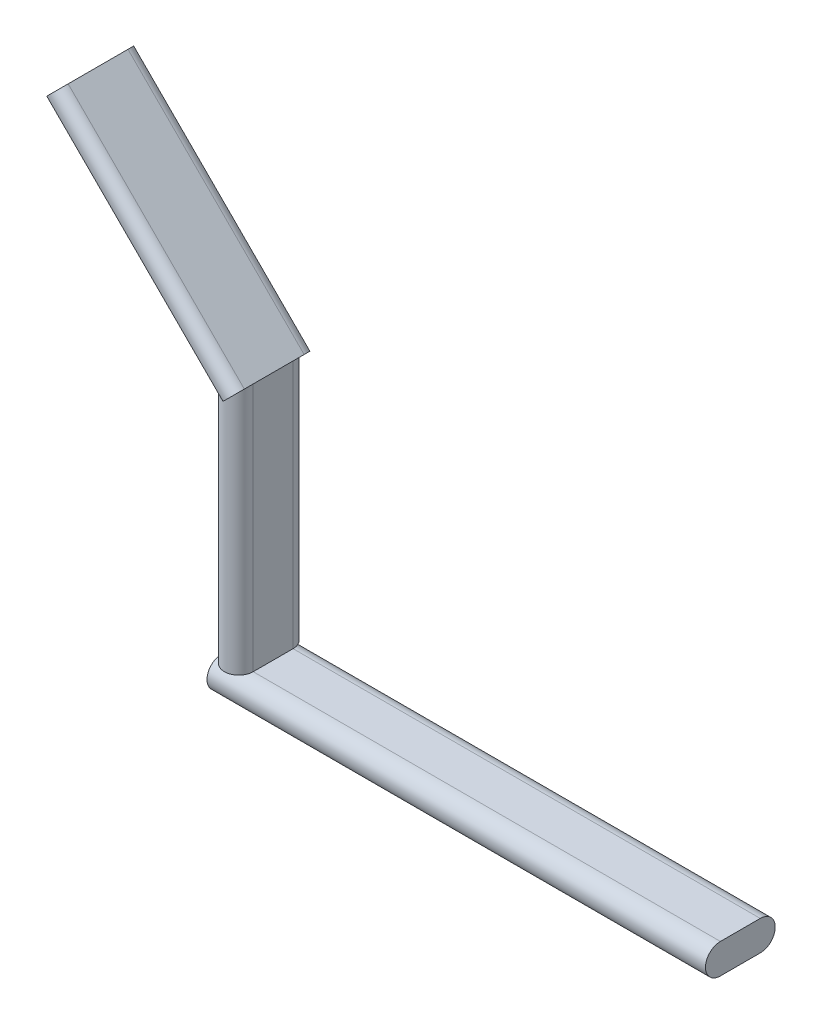
ISO-10303-21;
HEADER;
FILE_DESCRIPTION(('STEP AP214'),'2;1');
FILE_NAME('part.step','',(''),(''),'','','');
FILE_SCHEMA(('AUTOMOTIVE_DESIGN { 1 0 10303 214 1 1 1 1 }'));
ENDSEC;
DATA;
#1=APPLICATION_CONTEXT('core data for automotive mechanical design processes');
#2=APPLICATION_PROTOCOL_DEFINITION('international standard','automotive_design',2000,#1);
#3=PRODUCT_CONTEXT('',#1,'mechanical');
#4=PRODUCT('Part','Part','',(#3));
#5=PRODUCT_RELATED_PRODUCT_CATEGORY('part','',(#4));
#6=PRODUCT_DEFINITION_FORMATION('','',#4);
#7=PRODUCT_DEFINITION_CONTEXT('part definition',#1,'design');
#8=PRODUCT_DEFINITION('design','',#6,#7);
#9=PRODUCT_DEFINITION_SHAPE('','',#8);
#10=(LENGTH_UNIT() NAMED_UNIT(*) SI_UNIT(.MILLI.,.METRE.));
#11=(NAMED_UNIT(*) PLANE_ANGLE_UNIT() SI_UNIT($,.RADIAN.));
#12=(NAMED_UNIT(*) SI_UNIT($,.STERADIAN.) SOLID_ANGLE_UNIT());
#13=UNCERTAINTY_MEASURE_WITH_UNIT(LENGTH_MEASURE(1.E-05),#10,'distance_accuracy_value','');
#14=(GEOMETRIC_REPRESENTATION_CONTEXT(3) GLOBAL_UNCERTAINTY_ASSIGNED_CONTEXT((#13)) GLOBAL_UNIT_ASSIGNED_CONTEXT((#10,
#11,#12)) REPRESENTATION_CONTEXT('',''));
#15=CARTESIAN_POINT('',(0.,0.,0.));
#16=DIRECTION('',(0.,0.,1.));
#17=DIRECTION('',(1.,0.,0.));
#18=AXIS2_PLACEMENT_3D('',#15,#16,#17);
#19=CARTESIAN_POINT('',(250.,7.5,10.));
#20=DIRECTION('',(0.,-1.,0.));
#21=DIRECTION('',(0.,0.,-1.));
#22=AXIS2_PLACEMENT_3D('',#19,#20,#21);
#23=PLANE('',#22);
#24=DIRECTION('',(0.,0.,-1.));
#25=VECTOR('',#24,1.);
#26=CARTESIAN_POINT('',(15.673301609251,7.5,10.));
#27=LINE('',#26,#25);
#28=CARTESIAN_POINT('',(15.673301609251,7.5,10.));
#29=VERTEX_POINT('',#28);
#30=CARTESIAN_POINT('',(15.673301609251,7.50000000000001,-10.));
#31=VERTEX_POINT('',#30);
#32=EDGE_CURVE('E216',#29,#31,#27,.T.);
#33=ORIENTED_EDGE('',*,*,#32,.F.);
#34=DIRECTION('',(-1.,0.,0.));
#35=VECTOR('',#34,1.);
#36=CARTESIAN_POINT('',(250.,7.5,10.));
#37=LINE('',#36,#35);
#38=CARTESIAN_POINT('',(250.,7.5,10.));
#39=VERTEX_POINT('',#38);
#40=EDGE_CURVE('E269',#39,#29,#37,.T.);
#41=ORIENTED_EDGE('',*,*,#40,.F.);
#42=DIRECTION('',(0.,0.,1.));
#43=VECTOR('',#42,1.);
#44=CARTESIAN_POINT('',(250.,7.5,10.));
#45=LINE('',#44,#43);
#46=CARTESIAN_POINT('',(250.,7.5,-10.));
#47=VERTEX_POINT('',#46);
#48=EDGE_CURVE('E252',#47,#39,#45,.T.);
#49=ORIENTED_EDGE('',*,*,#48,.F.);
#50=DIRECTION('',(-1.,0.,0.));
#51=VECTOR('',#50,1.);
#52=CARTESIAN_POINT('',(250.,7.5,-10.));
#53=LINE('',#52,#51);
#54=EDGE_CURVE('E275',#47,#31,#53,.T.);
#55=ORIENTED_EDGE('',*,*,#54,.T.);
#56=EDGE_LOOP('',(#33,#41,#49,#55));
#57=FACE_BOUND('',#56,.T.);
#58=ADVANCED_FACE('F43',(#57),#23,.F.);
#59=DIRECTION('',(0.,0.,1.));
#60=VECTOR('',#59,1.);
#61=CARTESIAN_POINT('',(1.22084357885299,7.5,10.));
#62=LINE('',#61,#60);
#63=CARTESIAN_POINT('',(1.22084357885299,7.5,-10.));
#64=VERTEX_POINT('',#63);
#65=CARTESIAN_POINT('',(1.22084357885299,7.5,10.));
#66=VERTEX_POINT('',#65);
#67=EDGE_CURVE('E212',#64,#66,#62,.T.);
#68=ORIENTED_EDGE('',*,*,#67,.F.);
#69=CARTESIAN_POINT('',(0.,7.5,-10.));
#70=VERTEX_POINT('',#69);
#71=EDGE_CURVE('E273',#64,#70,#53,.T.);
#72=ORIENTED_EDGE('',*,*,#71,.T.);
#73=DIRECTION('',(0.,0.,1.));
#74=VECTOR('',#73,1.);
#75=CARTESIAN_POINT('',(0.,7.5,10.));
#76=LINE('',#75,#74);
#77=CARTESIAN_POINT('',(0.,7.5,10.));
#78=VERTEX_POINT('',#77);
#79=EDGE_CURVE('E246',#70,#78,#76,.T.);
#80=ORIENTED_EDGE('',*,*,#79,.T.);
#81=EDGE_CURVE('E255',#66,#78,#37,.T.);
#82=ORIENTED_EDGE('',*,*,#81,.F.);
#83=EDGE_LOOP('',(#68,#72,#80,#82));
#84=FACE_BOUND('',#83,.T.);
#85=ADVANCED_FACE('F328',(#84),#23,.F.);
#86=CARTESIAN_POINT('',(250.,0.,10.));
#87=DIRECTION('',(-1.,0.,0.));
#88=DIRECTION('',(0.,0.,1.));
#89=AXIS2_PLACEMENT_3D('',#86,#87,#88);
#90=CYLINDRICAL_SURFACE('',#89,7.5);
#91=CARTESIAN_POINT('',(0.,0.,10.));
#92=DIRECTION('',(1.,0.,0.));
#93=DIRECTION('',(0.,0.,-1.));
#94=AXIS2_PLACEMENT_3D('',#91,#92,#93);
#95=CIRCLE('',#94,7.5);
#96=CARTESIAN_POINT('',(0.,-7.5,10.));
#97=VERTEX_POINT('',#96);
#98=EDGE_CURVE('E240',#78,#97,#95,.T.);
#99=ORIENTED_EDGE('',*,*,#98,.T.);
#100=DIRECTION('',(-1.,0.,0.));
#101=VECTOR('',#100,1.);
#102=CARTESIAN_POINT('',(250.,-7.5,10.));
#103=LINE('',#102,#101);
#104=CARTESIAN_POINT('',(250.,-7.5,10.));
#105=VERTEX_POINT('',#104);
#106=EDGE_CURVE('E284',#105,#97,#103,.T.);
#107=ORIENTED_EDGE('',*,*,#106,.F.);
#108=CARTESIAN_POINT('',(250.,0.,10.));
#109=DIRECTION('',(1.,0.,0.));
#110=DIRECTION('',(0.,0.,-1.));
#111=AXIS2_PLACEMENT_3D('',#108,#109,#110);
#112=CIRCLE('',#111,7.5);
#113=EDGE_CURVE('E241',#39,#105,#112,.T.);
#114=ORIENTED_EDGE('',*,*,#113,.F.);
#115=ORIENTED_EDGE('',*,*,#40,.T.);
#116=EDGE_CURVE('E274',#29,#66,#37,.T.);
#117=ORIENTED_EDGE('',*,*,#116,.T.);
#118=ORIENTED_EDGE('',*,*,#81,.T.);
#119=EDGE_LOOP('',(#99,#107,#114,#115,#117,#118));
#120=FACE_BOUND('',#119,.T.);
#121=ADVANCED_FACE('F45',(#120),#90,.T.);
#122=CARTESIAN_POINT('',(250.,-7.5,10.));
#123=DIRECTION('',(0.,1.,0.));
#124=DIRECTION('',(0.,0.,1.));
#125=AXIS2_PLACEMENT_3D('',#122,#123,#124);
#126=PLANE('',#125);
#127=DIRECTION('',(0.,0.,-1.));
#128=VECTOR('',#127,1.);
#129=CARTESIAN_POINT('',(0.,-7.5,10.));
#130=LINE('',#129,#128);
#131=CARTESIAN_POINT('',(0.,-7.5,-10.));
#132=VERTEX_POINT('',#131);
#133=EDGE_CURVE('E259',#97,#132,#130,.T.);
#134=ORIENTED_EDGE('',*,*,#133,.T.);
#135=DIRECTION('',(-1.,0.,0.));
#136=VECTOR('',#135,1.);
#137=CARTESIAN_POINT('',(250.,-7.5,-10.));
#138=LINE('',#137,#136);
#139=CARTESIAN_POINT('',(250.,-7.5,-10.));
#140=VERTEX_POINT('',#139);
#141=EDGE_CURVE('E279',#140,#132,#138,.T.);
#142=ORIENTED_EDGE('',*,*,#141,.F.);
#143=DIRECTION('',(0.,0.,-1.));
#144=VECTOR('',#143,1.);
#145=CARTESIAN_POINT('',(250.,-7.5,10.));
#146=LINE('',#145,#144);
#147=EDGE_CURVE('E245',#105,#140,#146,.T.);
#148=ORIENTED_EDGE('',*,*,#147,.F.);
#149=ORIENTED_EDGE('',*,*,#106,.T.);
#150=EDGE_LOOP('',(#134,#142,#148,#149));
#151=FACE_BOUND('',#150,.T.);
#152=ADVANCED_FACE('F342',(#151),#126,.F.);
#153=CARTESIAN_POINT('',(250.,0.,-10.));
#154=DIRECTION('',(-1.,0.,0.));
#155=DIRECTION('',(0.,0.,1.));
#156=AXIS2_PLACEMENT_3D('',#153,#154,#155);
#157=CYLINDRICAL_SURFACE('',#156,7.5);
#158=CARTESIAN_POINT('',(0.,0.,-10.));
#159=DIRECTION('',(1.,0.,0.));
#160=DIRECTION('',(0.,0.,-1.));
#161=AXIS2_PLACEMENT_3D('',#158,#159,#160);
#162=CIRCLE('',#161,7.5);
#163=EDGE_CURVE('E262',#132,#70,#162,.T.);
#164=ORIENTED_EDGE('',*,*,#163,.T.);
#165=ORIENTED_EDGE('',*,*,#71,.F.);
#166=EDGE_CURVE('E280',#31,#64,#53,.T.);
#167=ORIENTED_EDGE('',*,*,#166,.F.);
#168=ORIENTED_EDGE('',*,*,#54,.F.);
#169=CARTESIAN_POINT('',(250.,0.,-10.));
#170=DIRECTION('',(1.,0.,0.));
#171=DIRECTION('',(0.,0.,-1.));
#172=AXIS2_PLACEMENT_3D('',#169,#170,#171);
#173=CIRCLE('',#172,7.5);
#174=EDGE_CURVE('E249',#140,#47,#173,.T.);
#175=ORIENTED_EDGE('',*,*,#174,.F.);
#176=ORIENTED_EDGE('',*,*,#141,.T.);
#177=EDGE_LOOP('',(#164,#165,#167,#168,#175,#176));
#178=FACE_BOUND('',#177,.T.);
#179=ADVANCED_FACE('F339',(#178),#157,.T.);
#180=CARTESIAN_POINT('',(250.,0.,10.));
#181=DIRECTION('',(1.,0.,0.));
#182=DIRECTION('',(0.,0.,-1.));
#183=AXIS2_PLACEMENT_3D('',#180,#181,#182);
#184=PLANE('',#183);
#185=ORIENTED_EDGE('',*,*,#113,.T.);
#186=ORIENTED_EDGE('',*,*,#147,.T.);
#187=ORIENTED_EDGE('',*,*,#174,.T.);
#188=ORIENTED_EDGE('',*,*,#48,.T.);
#189=EDGE_LOOP('',(#185,#186,#187,#188));
#190=FACE_BOUND('',#189,.T.);
#191=ADVANCED_FACE('F341',(#190),#184,.T.);
#192=CARTESIAN_POINT('',(0.,0.,10.));
#193=DIRECTION('',(1.,0.,0.));
#194=DIRECTION('',(0.,0.,-1.));
#195=AXIS2_PLACEMENT_3D('',#192,#193,#194);
#196=PLANE('',#195);
#197=ORIENTED_EDGE('',*,*,#98,.F.);
#198=ORIENTED_EDGE('',*,*,#79,.F.);
#199=ORIENTED_EDGE('',*,*,#163,.F.);
#200=ORIENTED_EDGE('',*,*,#133,.F.);
#201=EDGE_LOOP('',(#197,#198,#199,#200));
#202=FACE_BOUND('',#201,.T.);
#203=ADVANCED_FACE('F337',(#202),#196,.F.);
#204=CARTESIAN_POINT('',(8.44707259405197,7.5,10.));
#205=DIRECTION('',(0.,1.,0.));
#206=DIRECTION('',(0.,0.,1.));
#207=AXIS2_PLACEMENT_3D('',#204,#205,#206);
#208=PLANE('',#207);
#209=CARTESIAN_POINT('',(8.44707259405197,7.5,-10.));
#210=DIRECTION('',(0.,1.,0.));
#211=DIRECTION('',(0.,0.,1.));
#212=AXIS2_PLACEMENT_3D('',#209,#210,#211);
#213=CIRCLE('',#212,7.22622901519898);
#214=EDGE_CURVE('E220',#31,#64,#213,.T.);
#215=ORIENTED_EDGE('',*,*,#214,.F.);
#216=ORIENTED_EDGE('',*,*,#166,.T.);
#217=EDGE_LOOP('',(#215,#216));
#218=FACE_BOUND('',#217,.T.);
#219=ADVANCED_FACE('F318',(#218),#208,.F.);
#220=CARTESIAN_POINT('',(8.44707259405197,132.5,10.));
#221=DIRECTION('',(0.,-1.,0.));
#222=DIRECTION('',(0.,0.,-1.));
#223=AXIS2_PLACEMENT_3D('',#220,#221,#222);
#224=CYLINDRICAL_SURFACE('',#223,7.22622901519898);
#225=CARTESIAN_POINT('',(15.673301609251,122.387857740654,10.));
#226=CARTESIAN_POINT('',(15.6732679284929,122.230298314662,10.0534970743603));
#227=CARTESIAN_POINT('',(15.6727055114558,122.074093908894,10.1112208257689));
#228=CARTESIAN_POINT('',(15.6697245041845,121.76499146469,10.2360679068415));
#229=CARTESIAN_POINT('',(15.6673005285418,121.612104344851,10.3032180452256));
#230=CARTESIAN_POINT('',(15.6597242745853,121.308581589749,10.4487991442777));
#231=CARTESIAN_POINT('',(15.6545259561278,121.15802942932,10.5274036940708));
#232=CARTESIAN_POINT('',(15.6402056870653,120.863810086675,10.6959739469547));
#233=CARTESIAN_POINT('',(15.6310886753921,120.720134490049,10.7859252486573));
#234=CARTESIAN_POINT('',(15.606185653996,120.427566604381,10.9884185577908));
#235=CARTESIAN_POINT('',(15.5898102843105,120.27965706044,11.1023324133107));
#236=CARTESIAN_POINT('',(15.5477641582907,120.000416655622,11.3468034550089));
#237=CARTESIAN_POINT('',(15.5221324110535,119.869019294495,11.47728932745));
#238=CARTESIAN_POINT('',(15.4646542878078,119.653818978912,11.7276838300515));
#239=CARTESIAN_POINT('',(15.43510478213,119.565762055324,11.8444158074118));
#240=CARTESIAN_POINT('',(15.3662201805771,119.409540504794,12.0879999867571));
#241=CARTESIAN_POINT('',(15.3268934488548,119.341358982739,12.2148434759305));
#242=CARTESIAN_POINT('',(15.2369836323785,119.229248870051,12.4768484700833));
#243=CARTESIAN_POINT('',(15.1862982026223,119.185554306243,12.6120769622714));
#244=CARTESIAN_POINT('',(15.0743424334132,119.126439967348,12.8843166362917));
#245=CARTESIAN_POINT('',(15.013074827735,119.11101290162,13.0213273492769));
#246=CARTESIAN_POINT('',(14.8912149984276,119.107714342181,13.2723279438684));
#247=CARTESIAN_POINT('',(14.8317371067377,119.116276126205,13.3868478274964));
#248=CARTESIAN_POINT('',(14.7080263498348,119.151060217251,13.6104289107113));
#249=CARTESIAN_POINT('',(14.6437914949098,119.177289951868,13.7194877937718));
#250=CARTESIAN_POINT('',(14.4729327897763,119.264181778529,13.9933269707272));
#251=CARTESIAN_POINT('',(14.3637143294009,119.336034007545,14.1529000144577));
#252=CARTESIAN_POINT('',(14.1404495075739,119.505330585983,14.4541326727011));
#253=CARTESIAN_POINT('',(14.0263889061988,119.602855541029,14.5957337470383));
#254=CARTESIAN_POINT('',(13.8058133271434,119.805820702078,14.8505727279498));
#255=CARTESIAN_POINT('',(13.6995286759103,119.909787101893,14.9652129388146));
#256=CARTESIAN_POINT('',(13.4852740981205,120.128131580176,15.1824917082664));
#257=CARTESIAN_POINT('',(13.3773027898432,120.242518610689,15.2851197713458));
#258=CARTESIAN_POINT('',(13.1598430268469,120.479025080812,15.4799200357146));
#259=CARTESIAN_POINT('',(13.0503519307321,120.601159789834,15.5720705228542));
#260=CARTESIAN_POINT('',(12.8301919334792,120.850927340066,15.7468597251432));
#261=CARTESIAN_POINT('',(12.7195233216332,120.97855885328,15.8295007202128));
#262=CARTESIAN_POINT('',(12.4940313223118,121.241326336702,15.9883240460109));
#263=CARTESIAN_POINT('',(12.379175381556,121.376571471059,16.0642782628391));
#264=CARTESIAN_POINT('',(12.1480801074022,121.650216068987,16.2080145245035));
#265=CARTESIAN_POINT('',(12.0318405085208,121.788616142715,16.2757949723306));
#266=CARTESIAN_POINT('',(11.7977920109271,122.067741083303,16.4038169542466));
#267=CARTESIAN_POINT('',(11.6799820407427,122.208467555049,16.4640530151838));
#268=CARTESIAN_POINT('',(11.44272276157,122.491424559645,16.5773651688033));
#269=CARTESIAN_POINT('',(11.3232732630317,122.633655265961,16.6304404257932));
#270=CARTESIAN_POINT('',(10.9615049436706,123.062514938452,16.7797013392102));
#271=CARTESIAN_POINT('',(10.7164486931356,123.350487785387,16.8655517904524));
#272=CARTESIAN_POINT('',(10.2178602317031,123.92565595598,17.0107092380832));
#273=CARTESIAN_POINT('',(9.96433027156858,124.212851464544,17.0700232237359));
#274=CARTESIAN_POINT('',(9.56661293027373,124.651647429528,17.1403783535081));
#275=CARTESIAN_POINT('',(9.42581066373991,124.804813914698,17.1610723443501));
#276=CARTESIAN_POINT('',(9.14131430184759,125.109329021605,17.1942291774789));
#277=CARTESIAN_POINT('',(8.99762054097099,125.260677850406,17.2066929662414));
#278=CARTESIAN_POINT('',(8.70728792824963,125.56106094581,17.2230057839483));
#279=CARTESIAN_POINT('',(8.56064850943136,125.710094756842,17.2268531380756));
#280=CARTESIAN_POINT('',(8.26455796505019,126.005308930863,17.225440471413));
#281=CARTESIAN_POINT('',(8.11510687547672,126.151489330328,17.2201805671178));
#282=CARTESIAN_POINT('',(7.81466737428027,126.439568083082,17.2000667566942));
#283=CARTESIAN_POINT('',(7.66369591922419,126.581488529632,17.1852772234852));
#284=CARTESIAN_POINT('',(7.35969640765024,126.861682931108,17.1455924938078));
#285=CARTESIAN_POINT('',(7.20666833993152,126.999956866163,17.1206972422794));
#286=CARTESIAN_POINT('',(6.89929235564944,127.272547566631,17.0602607776287));
#287=CARTESIAN_POINT('',(6.744944959647,127.406865807541,17.0247235906978));
#288=CARTESIAN_POINT('',(6.43578382488222,127.671500888865,16.9425267378147));
#289=CARTESIAN_POINT('',(6.28097011307227,127.801817955846,16.8958677029562));
#290=CARTESIAN_POINT('',(5.99421896616313,128.040102553136,16.7986325367027));
#291=CARTESIAN_POINT('',(5.8621930039184,128.148589350139,16.7495843399659));
#292=CARTESIAN_POINT('',(5.59943230689999,128.362921466472,16.6429983424569));
#293=CARTESIAN_POINT('',(5.4686975317264,128.468766868608,16.5854608082108));
#294=CARTESIAN_POINT('',(5.20937738259071,128.678160154317,16.4619149230143));
#295=CARTESIAN_POINT('',(5.08079228806813,128.781707739758,16.3959054803201));
#296=CARTESIAN_POINT('',(4.82672159772472,128.986925901515,16.2555974409653));
#297=CARTESIAN_POINT('',(4.70123553224599,129.088596761651,16.1813001098673));
#298=CARTESIAN_POINT('',(4.45390842639458,129.290917816759,16.024493729757));
#299=CARTESIAN_POINT('',(4.33207875070818,129.391564292751,15.941961957477));
#300=CARTESIAN_POINT('',(4.09334837647834,129.592169617163,15.7693299236671));
#301=CARTESIAN_POINT('',(3.97644708035922,129.692128547712,15.6792305837069));
#302=CARTESIAN_POINT('',(3.74840782385079,129.892057760122,15.4920566658267));
#303=CARTESIAN_POINT('',(3.63726920395174,129.992028039367,15.3949828891434));
#304=CARTESIAN_POINT('',(3.42150670606346,130.192702989131,15.1945900145357));
#305=CARTESIAN_POINT('',(3.31688245838505,130.293407617613,15.0912712716687));
#306=CARTESIAN_POINT('',(3.05576636573329,130.555565038795,14.8172561050347));
#307=CARTESIAN_POINT('',(2.90467025335413,130.718145864154,14.6424513830664));
#308=CARTESIAN_POINT('',(2.6225219769316,131.049762943385,14.2831255494328));
#309=CARTESIAN_POINT('',(2.49146535882232,131.218797752297,14.0986066091847));
#310=CARTESIAN_POINT('',(2.31046607691158,131.4793788222,13.8174587054015));
#311=CARTESIAN_POINT('',(2.25261524350361,131.567622473519,13.7227909426165));
#312=CARTESIAN_POINT('',(2.1422737948336,131.74662336922,13.5326993112409));
#313=CARTESIAN_POINT('',(2.08978313480125,131.837380592599,13.4372754489727));
#314=CARTESIAN_POINT('',(1.9901261777339,132.021712769648,13.2462043366359));
#315=CARTESIAN_POINT('',(1.94296412545578,132.115289895526,13.1505569695677));
#316=CARTESIAN_POINT('',(1.85392602208504,132.30538954343,12.9597174540408));
#317=CARTESIAN_POINT('',(1.81205030247798,132.40191224969,12.8645253344887));
#318=CARTESIAN_POINT('',(1.77277757063213,132.5,12.7698685384792));
#319=B_SPLINE_CURVE_WITH_KNOTS('',3,(#225,#226,#227,#228,#229,#230,#231,#232,#233,#234,#235,
#236,#237,#238,#239,#240,#241,#242,#243,#244,#245,#246,#247,#248,#249,#250,#251,#252,#253,#254,
#255,#256,#257,#258,#259,#260,#261,#262,#263,#264,#265,#266,#267,#268,#269,#270,#271,#272,#273,
#274,#275,#276,#277,#278,#279,#280,#281,#282,#283,#284,#285,#286,#287,#288,#289,#290,#291,#292,
#293,#294,#295,#296,#297,#298,#299,#300,#301,#302,#303,#304,#305,#306,#307,#308,#309,#310,#311,
#312,#313,#314,#315,#316,#317,#318),.UNSPECIFIED.,.F.,.F.,(4,2,2,2,2,2,2,2,2,2,2,2,2,2,2,2,2,2,
2,2,2,2,2,2,2,2,2,2,2,2,2,2,2,2,2,2,2,2,2,2,2,2,2,2,2,2,4),(0.,0.499233864663587,
0.999917457190928,1.50918071293744,2.01780399133531,2.57872796764677,3.13731511607508,
3.58321478474889,4.02873430302038,4.4784421365876,4.92803396696189,5.31446398212669,
5.70105655374721,6.31637024694059,6.93363939601,7.49604846840257,8.05894532929471,
8.62298827880605,9.1868957148571,9.76569070811128,10.3445986050105,10.9239240733972,
11.5033170928455,12.6654902746,13.8273571787903,14.4544301674542,15.0814310299718,
15.7085537550276,16.3356684583546,16.9585907729525,17.5815164815232,18.2042068140854,
18.8268618213721,19.3599854993046,19.8930924431559,20.426268155653,20.9593625632535,
21.4939710439378,22.028514514759,22.5629966740882,23.0974484739764,23.9440481016633,
24.7904592860227,25.2156317329912,25.6408006284587,26.0663058595195,26.4918377591351),.UNSPECIFIED.);
#320=CARTESIAN_POINT('',(8.72023033688857,125.546928727638,17.2210643694425));
#321=VERTEX_POINT('',#320);
#322=CARTESIAN_POINT('',(3.22994831145111,130.380716932356,15.));
#323=VERTEX_POINT('',#322);
#324=EDGE_CURVE('E11',#321,#323,#319,.T.);
#325=ORIENTED_EDGE('',*,*,#324,.T.);
#326=CARTESIAN_POINT('',(8.44707259405197,125.163592649755,10.));
#327=DIRECTION('',(-0.707106781186548,-0.707106781186548,0.));
#328=DIRECTION('',(0.707106781186548,-0.707106781186548,0.));
#329=AXIS2_PLACEMENT_3D('',#326,#327,#328);
#330=ELLIPSE('',#329,10.2194310781084,7.22622901519898);
#331=CARTESIAN_POINT('',(1.22084357885299,132.389821664954,10.));
#332=VERTEX_POINT('',#331);
#333=EDGE_CURVE('E148',#323,#332,#330,.T.);
#334=ORIENTED_EDGE('',*,*,#333,.T.);
#335=DIRECTION('',(0.,-1.,0.));
#336=VECTOR('',#335,1.);
#337=CARTESIAN_POINT('',(1.22084357885299,132.5,10.));
#338=LINE('',#337,#336);
#339=EDGE_CURVE('E211',#332,#66,#338,.T.);
#340=ORIENTED_EDGE('',*,*,#339,.T.);
#341=CARTESIAN_POINT('',(8.44707259405197,7.5,10.));
#342=DIRECTION('',(0.,1.,0.));
#343=DIRECTION('',(0.,0.,1.));
#344=AXIS2_PLACEMENT_3D('',#341,#342,#343);
#345=CIRCLE('',#344,7.22622901519898);
#346=EDGE_CURVE('E206',#66,#29,#345,.T.);
#347=ORIENTED_EDGE('',*,*,#346,.T.);
#348=DIRECTION('',(0.,-1.,0.));
#349=VECTOR('',#348,1.);
#350=CARTESIAN_POINT('',(15.673301609251,132.5,10.));
#351=LINE('',#350,#349);
#352=CARTESIAN_POINT('',(15.673301609251,132.5,10.));
#353=VERTEX_POINT('',#352);
#354=EDGE_CURVE('E236',#353,#29,#351,.T.);
#355=ORIENTED_EDGE('',*,*,#354,.F.);
#356=CARTESIAN_POINT('',(8.44707259405197,125.273770984801,10.));
#357=DIRECTION('',(0.707106781186548,-0.707106781186548,0.));
#358=DIRECTION('',(-0.707106781186548,-0.707106781186548,0.));
#359=AXIS2_PLACEMENT_3D('',#356,#357,#358);
#360=ELLIPSE('',#359,10.2194310781084,7.22622901519898);
#361=EDGE_CURVE('E68',#353,#321,#360,.T.);
#362=ORIENTED_EDGE('',*,*,#361,.T.);
#363=EDGE_LOOP('',(#325,#334,#340,#347,#355,#362));
#364=FACE_BOUND('',#363,.T.);
#365=ADVANCED_FACE('F378',(#364),#224,.T.);
#366=CARTESIAN_POINT('',(15.673301609251,132.5,10.));
#367=DIRECTION('',(-1.,0.,0.));
#368=DIRECTION('',(0.,0.,1.));
#369=AXIS2_PLACEMENT_3D('',#366,#367,#368);
#370=PLANE('',#369);
#371=ORIENTED_EDGE('',*,*,#32,.T.);
#372=DIRECTION('',(0.,-1.,0.));
#373=VECTOR('',#372,1.);
#374=CARTESIAN_POINT('',(15.673301609251,132.5,-9.99999999999998));
#375=LINE('',#374,#373);
#376=CARTESIAN_POINT('',(15.6733016092509,132.5,-9.99999999999998));
#377=VERTEX_POINT('',#376);
#378=EDGE_CURVE('E232',#377,#31,#375,.T.);
#379=ORIENTED_EDGE('',*,*,#378,.F.);
#380=DIRECTION('',(0.,0.,-1.));
#381=VECTOR('',#380,1.);
#382=CARTESIAN_POINT('',(15.673301609251,132.5,10.));
#383=LINE('',#382,#381);
#384=EDGE_CURVE('E207',#353,#377,#383,.T.);
#385=ORIENTED_EDGE('',*,*,#384,.F.);
#386=ORIENTED_EDGE('',*,*,#354,.T.);
#387=EDGE_LOOP('',(#371,#379,#385,#386));
#388=FACE_BOUND('',#387,.T.);
#389=ADVANCED_FACE('F324',(#388),#370,.F.);
#390=CARTESIAN_POINT('',(8.44707259405197,132.5,-9.99999999999998));
#391=DIRECTION('',(0.,-1.,0.));
#392=DIRECTION('',(0.,0.,-1.));
#393=AXIS2_PLACEMENT_3D('',#390,#391,#392);
#394=CYLINDRICAL_SURFACE('',#393,7.22622901519898);
#395=DIRECTION('',(0.,-1.,0.));
#396=VECTOR('',#395,1.);
#397=CARTESIAN_POINT('',(1.22084357885299,132.5,-9.99999999999998));
#398=LINE('',#397,#396);
#399=CARTESIAN_POINT('',(1.22084357885299,132.389821664954,-9.99999999999998));
#400=VERTEX_POINT('',#399);
#401=EDGE_CURVE('E229',#400,#64,#398,.T.);
#402=ORIENTED_EDGE('',*,*,#401,.F.);
#403=CARTESIAN_POINT('',(8.44707259405197,125.163592649755,-9.99999999999998));
#404=DIRECTION('',(-0.707106781186548,-0.707106781186548,0.));
#405=DIRECTION('',(0.707106781186548,-0.707106781186548,0.));
#406=AXIS2_PLACEMENT_3D('',#403,#404,#405);
#407=ELLIPSE('',#406,10.2194310781084,7.22622901519898);
#408=CARTESIAN_POINT('',(3.22994831145109,130.380716932356,-15.));
#409=VERTEX_POINT('',#408);
#410=EDGE_CURVE('E201',#400,#409,#407,.T.);
#411=ORIENTED_EDGE('',*,*,#410,.T.);
#412=CARTESIAN_POINT('',(3.22994831145109,130.380716932356,-15.));
#413=CARTESIAN_POINT('',(3.31529351193565,130.29536237191,-15.0890710188463));
#414=CARTESIAN_POINT('',(3.40318071133047,130.21051883831,-15.1761902517942));
#415=CARTESIAN_POINT('',(3.58360961536831,130.041420030219,-15.3460653416347));
#416=CARTESIAN_POINT('',(3.67615121878522,129.957164742979,-15.4288212933419));
#417=CARTESIAN_POINT('',(3.86544648772515,129.78881981014,-15.5894997548951));
#418=CARTESIAN_POINT('',(3.96219940731229,129.704730137943,-15.6674231148399));
#419=CARTESIAN_POINT('',(4.15943493571485,129.536289127543,-15.8180719373267));
#420=CARTESIAN_POINT('',(4.25991752281993,129.451937790866,-15.8907974301181));
#421=CARTESIAN_POINT('',(4.56528913295191,129.198625476782,-16.1000617869671));
#422=CARTESIAN_POINT('',(4.7749945955525,129.028628562514,-16.2284442547583));
#423=CARTESIAN_POINT('',(5.20279733842697,128.683255376736,-16.4616148768598));
#424=CARTESIAN_POINT('',(5.42089321766552,128.507880004306,-16.5664069504535));
#425=CARTESIAN_POINT('',(5.86289648237616,128.148460563598,-16.7526567464674));
#426=CARTESIAN_POINT('',(6.08683510338815,127.96436154158,-16.8339343768316));
#427=CARTESIAN_POINT('',(6.53509804005349,127.587776851883,-16.9726491048067));
#428=CARTESIAN_POINT('',(6.75942242808661,127.395289395123,-17.0300810888612));
#429=CARTESIAN_POINT('',(7.20515466010001,127.002241964675,-17.1223453410766));
#430=CARTESIAN_POINT('',(7.42656525895292,126.801690471325,-17.157200723635));
#431=CARTESIAN_POINT('',(7.86464818933016,126.393194128673,-17.2060911336894));
#432=CARTESIAN_POINT('',(8.08132228587334,126.185252111942,-17.2201340517302));
#433=CARTESIAN_POINT('',(8.36663781210508,125.903662062441,-17.2261355678838));
#434=CARTESIAN_POINT('',(8.43786168188366,125.832706884038,-17.2265710943239));
#435=CARTESIAN_POINT('',(8.57957608384783,125.690241459351,-17.2253610281185));
#436=CARTESIAN_POINT('',(8.65006734095175,125.618731914968,-17.2237177401651));
#437=CARTESIAN_POINT('',(8.7202303368886,125.546928727638,-17.2210643694425));
#438=B_SPLINE_CURVE_WITH_KNOTS('',3,(#412,#413,#414,#415,#416,#417,#418,#419,#420,#421,#422,
#423,#424,#425,#426,#427,#428,#429,#430,#431,#432,#433,#434,#435,#436,#437),.UNSPECIFIED.,.F.,
.F.,(4,2,2,2,2,2,2,2,2,2,2,2,4),(0.,0.449988583027862,0.899967383725231,1.34986680301886,
1.79976360386518,2.6953575557152,3.59080260453047,4.49293436083471,5.39525947411489,
6.29665930166506,7.19771729767323,7.49931092650283,7.80057048431375),.UNSPECIFIED.);
#439=CARTESIAN_POINT('',(8.72023033688859,125.546928727638,-17.2210643694425));
#440=VERTEX_POINT('',#439);
#441=EDGE_CURVE('E58',#409,#440,#438,.T.);
#442=ORIENTED_EDGE('',*,*,#441,.T.);
#443=CARTESIAN_POINT('',(8.44707259405197,125.273770984801,-9.99999999999998));
#444=DIRECTION('',(0.707106781186548,-0.707106781186548,0.));
#445=DIRECTION('',(-0.707106781186548,-0.707106781186548,0.));
#446=AXIS2_PLACEMENT_3D('',#443,#444,#445);
#447=ELLIPSE('',#446,10.2194310781084,7.22622901519898);
#448=EDGE_CURVE('E189',#440,#377,#447,.T.);
#449=ORIENTED_EDGE('',*,*,#448,.T.);
#450=ORIENTED_EDGE('',*,*,#378,.T.);
#451=ORIENTED_EDGE('',*,*,#214,.T.);
#452=EDGE_LOOP('',(#402,#411,#442,#449,#450,#451));
#453=FACE_BOUND('',#452,.T.);
#454=ADVANCED_FACE('F297',(#453),#394,.T.);
#455=CARTESIAN_POINT('',(1.22084357885299,132.5,10.));
#456=DIRECTION('',(1.,0.,0.));
#457=DIRECTION('',(0.,0.,-1.));
#458=AXIS2_PLACEMENT_3D('',#455,#456,#457);
#459=PLANE('',#458);
#460=ORIENTED_EDGE('',*,*,#339,.F.);
#461=DIRECTION('',(0.,0.,-1.));
#462=VECTOR('',#461,1.);
#463=CARTESIAN_POINT('',(1.22084357885299,132.389821664954,10.));
#464=LINE('',#463,#462);
#465=EDGE_CURVE('E288',#332,#400,#464,.T.);
#466=ORIENTED_EDGE('',*,*,#465,.T.);
#467=ORIENTED_EDGE('',*,*,#401,.T.);
#468=ORIENTED_EDGE('',*,*,#67,.T.);
#469=EDGE_LOOP('',(#460,#466,#467,#468));
#470=FACE_BOUND('',#469,.T.);
#471=ADVANCED_FACE('F316',(#470),#459,.F.);
#472=ORIENTED_EDGE('',*,*,#116,.F.);
#473=ORIENTED_EDGE('',*,*,#346,.F.);
#474=EDGE_LOOP('',(#472,#473));
#475=FACE_BOUND('',#474,.T.);
#476=ADVANCED_FACE('F314',(#475),#208,.F.);
#477=CARTESIAN_POINT('',(-76.0750637928798,217.528329894506,15.));
#478=DIRECTION('',(0.707106781186548,-0.707106781186548,0.));
#479=DIRECTION('',(0.707106781186548,0.707106781186548,0.));
#480=AXIS2_PLACEMENT_3D('',#477,#478,#479);
#481=CYLINDRICAL_SURFACE('',#480,5.54555624870367);
#482=ORIENTED_EDGE('',*,*,#324,.F.);
#483=CARTESIAN_POINT('',(12.3132838554386,129.139982246188,15.));
#484=DIRECTION('',(0.707106781186548,-0.707106781186548,0.));
#485=DIRECTION('',(0.707106781186548,0.707106781186548,0.));
#486=AXIS2_PLACEMENT_3D('',#483,#484,#485);
#487=CIRCLE('',#486,5.54555624870367);
#488=CARTESIAN_POINT('',(16.2345842843484,133.061282675097,15.));
#489=VERTEX_POINT('',#488);
#490=EDGE_CURVE('E181',#489,#321,#487,.T.);
#491=ORIENTED_EDGE('',*,*,#490,.F.);
#492=DIRECTION('',(0.707106781186548,-0.707106781186548,0.));
#493=VECTOR('',#492,1.);
#494=CARTESIAN_POINT('',(-72.1537633639701,221.449630323416,15.));
#495=LINE('',#494,#493);
#496=CARTESIAN_POINT('',(-72.1537633639701,221.449630323416,15.));
#497=VERTEX_POINT('',#496);
#498=EDGE_CURVE('E168',#497,#489,#495,.T.);
#499=ORIENTED_EDGE('',*,*,#498,.F.);
#500=CARTESIAN_POINT('',(-76.0750637928798,217.528329894506,15.));
#501=DIRECTION('',(0.707106781186548,-0.707106781186548,0.));
#502=DIRECTION('',(0.707106781186548,0.707106781186548,0.));
#503=AXIS2_PLACEMENT_3D('',#500,#501,#502);
#504=CIRCLE('',#503,5.54555624870367);
#505=CARTESIAN_POINT('',(-79.9963642217897,213.607029465596,15.));
#506=VERTEX_POINT('',#505);
#507=EDGE_CURVE('E160',#497,#506,#504,.T.);
#508=ORIENTED_EDGE('',*,*,#507,.T.);
#509=DIRECTION('',(0.707106781186548,-0.707106781186548,0.));
#510=VECTOR('',#509,1.);
#511=CARTESIAN_POINT('',(-79.9963642217897,213.607029465596,15.));
#512=LINE('',#511,#510);
#513=EDGE_CURVE('E142',#506,#323,#512,.T.);
#514=ORIENTED_EDGE('',*,*,#513,.T.);
#515=EDGE_LOOP('',(#482,#491,#499,#508,#514));
#516=FACE_BOUND('',#515,.T.);
#517=ADVANCED_FACE('F166',(#516),#481,.T.);
#518=CARTESIAN_POINT('',(-76.0750637928798,217.528329894506,-14.9999999999999));
#519=DIRECTION('',(0.707106781186548,-0.707106781186548,0.));
#520=DIRECTION('',(0.707106781186548,0.707106781186548,0.));
#521=AXIS2_PLACEMENT_3D('',#518,#519,#520);
#522=CYLINDRICAL_SURFACE('',#521,5.54555624870367);
#523=ORIENTED_EDGE('',*,*,#441,.F.);
#524=DIRECTION('',(0.707106781186548,-0.707106781186548,0.));
#525=VECTOR('',#524,1.);
#526=CARTESIAN_POINT('',(-79.9963642217897,213.607029465596,-15.));
#527=LINE('',#526,#525);
#528=CARTESIAN_POINT('',(-79.9963642217897,213.607029465596,-15.));
#529=VERTEX_POINT('',#528);
#530=EDGE_CURVE('E152',#529,#409,#527,.T.);
#531=ORIENTED_EDGE('',*,*,#530,.F.);
#532=CARTESIAN_POINT('',(-76.0750637928798,217.528329894506,-14.9999999999999));
#533=DIRECTION('',(0.707106781186548,-0.707106781186548,0.));
#534=DIRECTION('',(0.707106781186548,0.707106781186548,0.));
#535=AXIS2_PLACEMENT_3D('',#532,#533,#534);
#536=CIRCLE('',#535,5.54555624870367);
#537=CARTESIAN_POINT('',(-72.1537633639701,221.449630323416,-14.9999999999999));
#538=VERTEX_POINT('',#537);
#539=EDGE_CURVE('E163',#529,#538,#536,.T.);
#540=ORIENTED_EDGE('',*,*,#539,.T.);
#541=DIRECTION('',(0.707106781186548,-0.707106781186548,0.));
#542=VECTOR('',#541,1.);
#543=CARTESIAN_POINT('',(-72.1537633639701,221.449630323416,-14.9999999999999));
#544=LINE('',#543,#542);
#545=CARTESIAN_POINT('',(16.2345842843484,133.061282675097,-15.));
#546=VERTEX_POINT('',#545);
#547=EDGE_CURVE('E190',#538,#546,#544,.T.);
#548=ORIENTED_EDGE('',*,*,#547,.T.);
#549=CARTESIAN_POINT('',(12.3132838554386,129.139982246188,-15.));
#550=DIRECTION('',(0.707106781186548,-0.707106781186548,0.));
#551=DIRECTION('',(0.707106781186548,0.707106781186548,0.));
#552=AXIS2_PLACEMENT_3D('',#549,#550,#551);
#553=CIRCLE('',#552,5.54555624870367);
#554=EDGE_CURVE('E174',#440,#546,#553,.T.);
#555=ORIENTED_EDGE('',*,*,#554,.F.);
#556=EDGE_LOOP('',(#523,#531,#540,#548,#555));
#557=FACE_BOUND('',#556,.T.);
#558=ADVANCED_FACE('F301',(#557),#522,.T.);
#559=CARTESIAN_POINT('',(-79.9963642217897,213.607029465596,15.));
#560=DIRECTION('',(-0.707106781186548,-0.707106781186548,0.));
#561=DIRECTION('',(0.707106781186548,-0.707106781186548,0.));
#562=AXIS2_PLACEMENT_3D('',#559,#560,#561);
#563=PLANE('',#562);
#564=ORIENTED_EDGE('',*,*,#333,.F.);
#565=ORIENTED_EDGE('',*,*,#513,.F.);
#566=DIRECTION('',(0.,0.,-1.));
#567=VECTOR('',#566,1.);
#568=CARTESIAN_POINT('',(-79.9963642217897,213.607029465596,15.));
#569=LINE('',#568,#567);
#570=EDGE_CURVE('E146',#506,#529,#569,.T.);
#571=ORIENTED_EDGE('',*,*,#570,.T.);
#572=ORIENTED_EDGE('',*,*,#530,.T.);
#573=ORIENTED_EDGE('',*,*,#410,.F.);
#574=ORIENTED_EDGE('',*,*,#465,.F.);
#575=EDGE_LOOP('',(#564,#565,#571,#572,#573,#574));
#576=FACE_BOUND('',#575,.T.);
#577=ADVANCED_FACE('F144',(#576),#563,.T.);
#578=CARTESIAN_POINT('',(12.3132838554386,129.139982246188,15.));
#579=DIRECTION('',(0.707106781186548,-0.707106781186548,0.));
#580=DIRECTION('',(0.707106781186548,0.707106781186548,0.));
#581=AXIS2_PLACEMENT_3D('',#578,#579,#580);
#582=PLANE('',#581);
#583=ORIENTED_EDGE('',*,*,#361,.F.);
#584=ORIENTED_EDGE('',*,*,#384,.T.);
#585=ORIENTED_EDGE('',*,*,#448,.F.);
#586=ORIENTED_EDGE('',*,*,#554,.T.);
#587=DIRECTION('',(0.,0.,1.));
#588=VECTOR('',#587,1.);
#589=CARTESIAN_POINT('',(16.2345842843484,133.061282675097,15.));
#590=LINE('',#589,#588);
#591=EDGE_CURVE('E170',#546,#489,#590,.T.);
#592=ORIENTED_EDGE('',*,*,#591,.T.);
#593=ORIENTED_EDGE('',*,*,#490,.T.);
#594=EDGE_LOOP('',(#583,#584,#585,#586,#592,#593));
#595=FACE_BOUND('',#594,.T.);
#596=ADVANCED_FACE('F310',(#595),#582,.T.);
#597=CARTESIAN_POINT('',(-72.1537633639701,221.449630323416,15.));
#598=DIRECTION('',(0.707106781186548,0.707106781186548,0.));
#599=DIRECTION('',(-0.707106781186548,0.707106781186548,0.));
#600=AXIS2_PLACEMENT_3D('',#597,#598,#599);
#601=PLANE('',#600);
#602=ORIENTED_EDGE('',*,*,#591,.F.);
#603=ORIENTED_EDGE('',*,*,#547,.F.);
#604=DIRECTION('',(0.,0.,1.));
#605=VECTOR('',#604,1.);
#606=CARTESIAN_POINT('',(-72.1537633639701,221.449630323416,15.));
#607=LINE('',#606,#605);
#608=EDGE_CURVE('E153',#538,#497,#607,.T.);
#609=ORIENTED_EDGE('',*,*,#608,.T.);
#610=ORIENTED_EDGE('',*,*,#498,.T.);
#611=EDGE_LOOP('',(#602,#603,#609,#610));
#612=FACE_BOUND('',#611,.T.);
#613=ADVANCED_FACE('F307',(#612),#601,.T.);
#614=CARTESIAN_POINT('',(-76.0750637928798,217.528329894506,15.));
#615=DIRECTION('',(0.707106781186548,-0.707106781186548,0.));
#616=DIRECTION('',(0.707106781186548,0.707106781186548,0.));
#617=AXIS2_PLACEMENT_3D('',#614,#615,#616);
#618=PLANE('',#617);
#619=ORIENTED_EDGE('',*,*,#507,.F.);
#620=ORIENTED_EDGE('',*,*,#608,.F.);
#621=ORIENTED_EDGE('',*,*,#539,.F.);
#622=ORIENTED_EDGE('',*,*,#570,.F.);
#623=EDGE_LOOP('',(#619,#620,#621,#622));
#624=FACE_BOUND('',#623,.T.);
#625=ADVANCED_FACE('F158',(#624),#618,.F.);
#626=CLOSED_SHELL('',(#58,#85,#121,#152,#179,#191,#203,#219,#365,#389,#454,#471,#476,#517,#558,
#577,#596,#613,#625));
#627=MANIFOLD_SOLID_BREP('B2',#626);
#628=ADVANCED_BREP_SHAPE_REPRESENTATION('',(#18,#627),#14);
#629=SHAPE_DEFINITION_REPRESENTATION(#9,#628);
ENDSEC;
END-ISO-10303-21;
